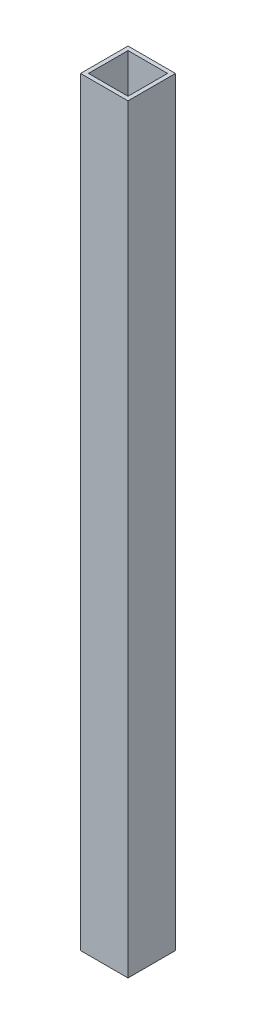
ISO-10303-21;
HEADER;
FILE_DESCRIPTION(('STEP AP214'),'2;1');
FILE_NAME('part.step','',(''),(''),'','','');
FILE_SCHEMA(('AUTOMOTIVE_DESIGN { 1 0 10303 214 1 1 1 1 }'));
ENDSEC;
DATA;
#1=APPLICATION_CONTEXT('core data for automotive mechanical design processes');
#2=APPLICATION_PROTOCOL_DEFINITION('international standard','automotive_design',2000,#1);
#3=PRODUCT_CONTEXT('',#1,'mechanical');
#4=PRODUCT('Part','Part','',(#3));
#5=PRODUCT_RELATED_PRODUCT_CATEGORY('part','',(#4));
#6=PRODUCT_DEFINITION_FORMATION('','',#4);
#7=PRODUCT_DEFINITION_CONTEXT('part definition',#1,'design');
#8=PRODUCT_DEFINITION('design','',#6,#7);
#9=PRODUCT_DEFINITION_SHAPE('','',#8);
#10=(LENGTH_UNIT() NAMED_UNIT(*) SI_UNIT(.MILLI.,.METRE.));
#11=(NAMED_UNIT(*) PLANE_ANGLE_UNIT() SI_UNIT($,.RADIAN.));
#12=(NAMED_UNIT(*) SI_UNIT($,.STERADIAN.) SOLID_ANGLE_UNIT());
#13=UNCERTAINTY_MEASURE_WITH_UNIT(LENGTH_MEASURE(1.E-05),#10,'distance_accuracy_value','');
#14=(GEOMETRIC_REPRESENTATION_CONTEXT(3) GLOBAL_UNCERTAINTY_ASSIGNED_CONTEXT((#13)) GLOBAL_UNIT_ASSIGNED_CONTEXT((#10,
#11,#12)) REPRESENTATION_CONTEXT('',''));
#15=CARTESIAN_POINT('',(0.,0.,0.));
#16=DIRECTION('',(0.,0.,1.));
#17=DIRECTION('',(1.,0.,0.));
#18=AXIS2_PLACEMENT_3D('',#15,#16,#17);
#19=CARTESIAN_POINT('',(0.,304.8,0.));
#20=DIRECTION('',(0.,-1.,0.));
#21=DIRECTION('',(0.,0.,-1.));
#22=AXIS2_PLACEMENT_3D('',#19,#20,#21);
#23=PLANE('',#22);
#24=DIRECTION('',(0.,0.,1.));
#25=VECTOR('',#24,1.);
#26=CARTESIAN_POINT('',(-9.525,304.8,-9.525));
#27=LINE('',#26,#25);
#28=CARTESIAN_POINT('',(-9.525,304.8,-9.525));
#29=VERTEX_POINT('',#28);
#30=CARTESIAN_POINT('',(-9.525,304.8,9.525));
#31=VERTEX_POINT('',#30);
#32=EDGE_CURVE('E159',#29,#31,#27,.T.);
#33=ORIENTED_EDGE('',*,*,#32,.T.);
#34=DIRECTION('',(1.,0.,0.));
#35=VECTOR('',#34,1.);
#36=CARTESIAN_POINT('',(9.525,304.8,9.525));
#37=LINE('',#36,#35);
#38=CARTESIAN_POINT('',(9.525,304.8,9.525));
#39=VERTEX_POINT('',#38);
#40=EDGE_CURVE('E163',#31,#39,#37,.T.);
#41=ORIENTED_EDGE('',*,*,#40,.T.);
#42=DIRECTION('',(0.,0.,-1.));
#43=VECTOR('',#42,1.);
#44=CARTESIAN_POINT('',(9.525,304.8,-9.52500000000001));
#45=LINE('',#44,#43);
#46=CARTESIAN_POINT('',(9.525,304.8,-9.52500000000001));
#47=VERTEX_POINT('',#46);
#48=EDGE_CURVE('E167',#39,#47,#45,.T.);
#49=ORIENTED_EDGE('',*,*,#48,.T.);
#50=DIRECTION('',(-1.,0.,0.));
#51=VECTOR('',#50,1.);
#52=CARTESIAN_POINT('',(9.525,304.8,-9.52500000000001));
#53=LINE('',#52,#51);
#54=EDGE_CURVE('E170',#47,#29,#53,.T.);
#55=ORIENTED_EDGE('',*,*,#54,.T.);
#56=EDGE_LOOP('',(#33,#41,#49,#55));
#57=FACE_BOUND('',#56,.T.);
#58=DIRECTION('',(0.,0.,1.));
#59=VECTOR('',#58,1.);
#60=CARTESIAN_POINT('',(-7.93750000000003,304.8,7.93750000000004));
#61=LINE('',#60,#59);
#62=CARTESIAN_POINT('',(-7.93750000000003,304.8,-7.93750000000001));
#63=VERTEX_POINT('',#62);
#64=CARTESIAN_POINT('',(-7.93750000000003,304.8,7.93750000000004));
#65=VERTEX_POINT('',#64);
#66=EDGE_CURVE('E111',#63,#65,#61,.T.);
#67=ORIENTED_EDGE('',*,*,#66,.F.);
#68=DIRECTION('',(-1.,0.,0.));
#69=VECTOR('',#68,1.);
#70=CARTESIAN_POINT('',(7.93750000000002,304.8,-7.93750000000001));
#71=LINE('',#70,#69);
#72=CARTESIAN_POINT('',(7.93750000000002,304.8,-7.93750000000001));
#73=VERTEX_POINT('',#72);
#74=EDGE_CURVE('E137',#73,#63,#71,.T.);
#75=ORIENTED_EDGE('',*,*,#74,.F.);
#76=DIRECTION('',(0.,0.,-1.));
#77=VECTOR('',#76,1.);
#78=CARTESIAN_POINT('',(7.93750000000002,304.8,7.93750000000004));
#79=LINE('',#78,#77);
#80=CARTESIAN_POINT('',(7.93750000000002,304.8,7.93750000000004));
#81=VERTEX_POINT('',#80);
#82=EDGE_CURVE('E133',#81,#73,#79,.T.);
#83=ORIENTED_EDGE('',*,*,#82,.F.);
#84=DIRECTION('',(1.,0.,0.));
#85=VECTOR('',#84,1.);
#86=CARTESIAN_POINT('',(7.93750000000002,304.8,7.93750000000004));
#87=LINE('',#86,#85);
#88=EDGE_CURVE('E120',#65,#81,#87,.T.);
#89=ORIENTED_EDGE('',*,*,#88,.F.);
#90=EDGE_LOOP('',(#67,#75,#83,#89));
#91=FACE_BOUND('',#90,.T.);
#92=ADVANCED_FACE('F45',(#57,#91),#23,.F.);
#93=CARTESIAN_POINT('',(0.,0.,0.));
#94=DIRECTION('',(0.,-1.,0.));
#95=DIRECTION('',(0.,0.,-1.));
#96=AXIS2_PLACEMENT_3D('',#93,#94,#95);
#97=PLANE('',#96);
#98=DIRECTION('',(0.,0.,1.));
#99=VECTOR('',#98,1.);
#100=CARTESIAN_POINT('',(-9.525,0.,-9.525));
#101=LINE('',#100,#99);
#102=CARTESIAN_POINT('',(-9.525,0.,-9.525));
#103=VERTEX_POINT('',#102);
#104=CARTESIAN_POINT('',(-9.525,0.,9.525));
#105=VERTEX_POINT('',#104);
#106=EDGE_CURVE('E129',#103,#105,#101,.T.);
#107=ORIENTED_EDGE('',*,*,#106,.F.);
#108=DIRECTION('',(-1.,0.,0.));
#109=VECTOR('',#108,1.);
#110=CARTESIAN_POINT('',(9.525,0.,-9.52500000000001));
#111=LINE('',#110,#109);
#112=CARTESIAN_POINT('',(9.525,0.,-9.52500000000001));
#113=VERTEX_POINT('',#112);
#114=EDGE_CURVE('E164',#113,#103,#111,.T.);
#115=ORIENTED_EDGE('',*,*,#114,.F.);
#116=DIRECTION('',(0.,0.,-1.));
#117=VECTOR('',#116,1.);
#118=CARTESIAN_POINT('',(9.525,0.,-9.52500000000001));
#119=LINE('',#118,#117);
#120=CARTESIAN_POINT('',(9.525,0.,9.525));
#121=VERTEX_POINT('',#120);
#122=EDGE_CURVE('E180',#121,#113,#119,.T.);
#123=ORIENTED_EDGE('',*,*,#122,.F.);
#124=DIRECTION('',(1.,0.,0.));
#125=VECTOR('',#124,1.);
#126=CARTESIAN_POINT('',(9.525,0.,9.525));
#127=LINE('',#126,#125);
#128=EDGE_CURVE('E177',#105,#121,#127,.T.);
#129=ORIENTED_EDGE('',*,*,#128,.F.);
#130=EDGE_LOOP('',(#107,#115,#123,#129));
#131=FACE_BOUND('',#130,.T.);
#132=DIRECTION('',(-1.,0.,0.));
#133=VECTOR('',#132,1.);
#134=CARTESIAN_POINT('',(7.93750000000002,0.,-7.93750000000001));
#135=LINE('',#134,#133);
#136=CARTESIAN_POINT('',(7.93750000000002,0.,-7.93750000000001));
#137=VERTEX_POINT('',#136);
#138=CARTESIAN_POINT('',(-7.93750000000003,0.,-7.93750000000001));
#139=VERTEX_POINT('',#138);
#140=EDGE_CURVE('E121',#137,#139,#135,.T.);
#141=ORIENTED_EDGE('',*,*,#140,.T.);
#142=DIRECTION('',(0.,0.,1.));
#143=VECTOR('',#142,1.);
#144=CARTESIAN_POINT('',(-7.93750000000003,0.,7.93750000000004));
#145=LINE('',#144,#143);
#146=CARTESIAN_POINT('',(-7.93750000000003,0.,7.93750000000004));
#147=VERTEX_POINT('',#146);
#148=EDGE_CURVE('E69',#139,#147,#145,.T.);
#149=ORIENTED_EDGE('',*,*,#148,.T.);
#150=DIRECTION('',(1.,0.,0.));
#151=VECTOR('',#150,1.);
#152=CARTESIAN_POINT('',(7.93750000000002,0.,7.93750000000004));
#153=LINE('',#152,#151);
#154=CARTESIAN_POINT('',(7.93750000000002,0.,7.93750000000004));
#155=VERTEX_POINT('',#154);
#156=EDGE_CURVE('E127',#147,#155,#153,.T.);
#157=ORIENTED_EDGE('',*,*,#156,.T.);
#158=DIRECTION('',(0.,0.,-1.));
#159=VECTOR('',#158,1.);
#160=CARTESIAN_POINT('',(7.93750000000002,0.,7.93750000000004));
#161=LINE('',#160,#159);
#162=EDGE_CURVE('E146',#155,#137,#161,.T.);
#163=ORIENTED_EDGE('',*,*,#162,.T.);
#164=EDGE_LOOP('',(#141,#149,#157,#163));
#165=FACE_BOUND('',#164,.T.);
#166=ADVANCED_FACE('F203',(#131,#165),#97,.T.);
#167=CARTESIAN_POINT('',(-9.525,304.8,-9.525));
#168=DIRECTION('',(1.,0.,0.));
#169=DIRECTION('',(0.,0.,-1.));
#170=AXIS2_PLACEMENT_3D('',#167,#168,#169);
#171=PLANE('',#170);
#172=ORIENTED_EDGE('',*,*,#106,.T.);
#173=DIRECTION('',(0.,-1.,0.));
#174=VECTOR('',#173,1.);
#175=CARTESIAN_POINT('',(-9.525,304.8,9.525));
#176=LINE('',#175,#174);
#177=EDGE_CURVE('E11',#31,#105,#176,.T.);
#178=ORIENTED_EDGE('',*,*,#177,.F.);
#179=ORIENTED_EDGE('',*,*,#32,.F.);
#180=DIRECTION('',(0.,-1.,0.));
#181=VECTOR('',#180,1.);
#182=CARTESIAN_POINT('',(-9.525,304.8,-9.525));
#183=LINE('',#182,#181);
#184=EDGE_CURVE('E173',#29,#103,#183,.T.);
#185=ORIENTED_EDGE('',*,*,#184,.T.);
#186=EDGE_LOOP('',(#172,#178,#179,#185));
#187=FACE_BOUND('',#186,.T.);
#188=ADVANCED_FACE('F47',(#187),#171,.F.);
#189=CARTESIAN_POINT('',(9.525,304.8,9.525));
#190=DIRECTION('',(0.,0.,-1.));
#191=DIRECTION('',(-1.,0.,0.));
#192=AXIS2_PLACEMENT_3D('',#189,#190,#191);
#193=PLANE('',#192);
#194=ORIENTED_EDGE('',*,*,#128,.T.);
#195=DIRECTION('',(0.,-1.,0.));
#196=VECTOR('',#195,1.);
#197=CARTESIAN_POINT('',(9.525,304.8,9.525));
#198=LINE('',#197,#196);
#199=EDGE_CURVE('E54',#39,#121,#198,.T.);
#200=ORIENTED_EDGE('',*,*,#199,.F.);
#201=ORIENTED_EDGE('',*,*,#40,.F.);
#202=ORIENTED_EDGE('',*,*,#177,.T.);
#203=EDGE_LOOP('',(#194,#200,#201,#202));
#204=FACE_BOUND('',#203,.T.);
#205=ADVANCED_FACE('F213',(#204),#193,.F.);
#206=CARTESIAN_POINT('',(9.525,304.8,-9.52500000000001));
#207=DIRECTION('',(-1.,0.,0.));
#208=DIRECTION('',(0.,0.,1.));
#209=AXIS2_PLACEMENT_3D('',#206,#207,#208);
#210=PLANE('',#209);
#211=ORIENTED_EDGE('',*,*,#122,.T.);
#212=DIRECTION('',(0.,-1.,0.));
#213=VECTOR('',#212,1.);
#214=CARTESIAN_POINT('',(9.525,304.8,-9.52500000000001));
#215=LINE('',#214,#213);
#216=EDGE_CURVE('E188',#47,#113,#215,.T.);
#217=ORIENTED_EDGE('',*,*,#216,.F.);
#218=ORIENTED_EDGE('',*,*,#48,.F.);
#219=ORIENTED_EDGE('',*,*,#199,.T.);
#220=EDGE_LOOP('',(#211,#217,#218,#219));
#221=FACE_BOUND('',#220,.T.);
#222=ADVANCED_FACE('F197',(#221),#210,.F.);
#223=CARTESIAN_POINT('',(9.525,304.8,-9.52500000000001));
#224=DIRECTION('',(0.,0.,1.));
#225=DIRECTION('',(1.,0.,0.));
#226=AXIS2_PLACEMENT_3D('',#223,#224,#225);
#227=PLANE('',#226);
#228=ORIENTED_EDGE('',*,*,#114,.T.);
#229=ORIENTED_EDGE('',*,*,#184,.F.);
#230=ORIENTED_EDGE('',*,*,#54,.F.);
#231=ORIENTED_EDGE('',*,*,#216,.T.);
#232=EDGE_LOOP('',(#228,#229,#230,#231));
#233=FACE_BOUND('',#232,.T.);
#234=ADVANCED_FACE('F207',(#233),#227,.F.);
#235=CARTESIAN_POINT('',(-7.93750000000003,304.8,7.93750000000004));
#236=DIRECTION('',(1.,0.,0.));
#237=DIRECTION('',(0.,0.,-1.));
#238=AXIS2_PLACEMENT_3D('',#235,#236,#237);
#239=PLANE('',#238);
#240=ORIENTED_EDGE('',*,*,#148,.F.);
#241=DIRECTION('',(0.,-1.,0.));
#242=VECTOR('',#241,1.);
#243=CARTESIAN_POINT('',(-7.93750000000003,304.8,-7.93750000000001));
#244=LINE('',#243,#242);
#245=EDGE_CURVE('E115',#63,#139,#244,.T.);
#246=ORIENTED_EDGE('',*,*,#245,.F.);
#247=ORIENTED_EDGE('',*,*,#66,.T.);
#248=DIRECTION('',(0.,-1.,0.));
#249=VECTOR('',#248,1.);
#250=CARTESIAN_POINT('',(-7.93750000000003,304.8,7.93750000000004));
#251=LINE('',#250,#249);
#252=EDGE_CURVE('E114',#65,#147,#251,.T.);
#253=ORIENTED_EDGE('',*,*,#252,.T.);
#254=EDGE_LOOP('',(#240,#246,#247,#253));
#255=FACE_BOUND('',#254,.T.);
#256=ADVANCED_FACE('F113',(#255),#239,.T.);
#257=CARTESIAN_POINT('',(7.93750000000002,304.8,7.93750000000004));
#258=DIRECTION('',(0.,0.,-1.));
#259=DIRECTION('',(-1.,0.,0.));
#260=AXIS2_PLACEMENT_3D('',#257,#258,#259);
#261=PLANE('',#260);
#262=ORIENTED_EDGE('',*,*,#156,.F.);
#263=ORIENTED_EDGE('',*,*,#252,.F.);
#264=ORIENTED_EDGE('',*,*,#88,.T.);
#265=DIRECTION('',(0.,-1.,0.));
#266=VECTOR('',#265,1.);
#267=CARTESIAN_POINT('',(7.93750000000002,304.8,7.93750000000004));
#268=LINE('',#267,#266);
#269=EDGE_CURVE('E130',#81,#155,#268,.T.);
#270=ORIENTED_EDGE('',*,*,#269,.T.);
#271=EDGE_LOOP('',(#262,#263,#264,#270));
#272=FACE_BOUND('',#271,.T.);
#273=ADVANCED_FACE('F124',(#272),#261,.T.);
#274=CARTESIAN_POINT('',(7.93750000000002,304.8,7.93750000000004));
#275=DIRECTION('',(-1.,0.,0.));
#276=DIRECTION('',(0.,0.,1.));
#277=AXIS2_PLACEMENT_3D('',#274,#275,#276);
#278=PLANE('',#277);
#279=ORIENTED_EDGE('',*,*,#162,.F.);
#280=ORIENTED_EDGE('',*,*,#269,.F.);
#281=ORIENTED_EDGE('',*,*,#82,.T.);
#282=DIRECTION('',(0.,-1.,0.));
#283=VECTOR('',#282,1.);
#284=CARTESIAN_POINT('',(7.93750000000002,304.8,-7.93750000000001));
#285=LINE('',#284,#283);
#286=EDGE_CURVE('E61',#73,#137,#285,.T.);
#287=ORIENTED_EDGE('',*,*,#286,.T.);
#288=EDGE_LOOP('',(#279,#280,#281,#287));
#289=FACE_BOUND('',#288,.T.);
#290=ADVANCED_FACE('F236',(#289),#278,.T.);
#291=CARTESIAN_POINT('',(7.93750000000002,304.8,-7.93750000000001));
#292=DIRECTION('',(0.,0.,1.));
#293=DIRECTION('',(1.,0.,0.));
#294=AXIS2_PLACEMENT_3D('',#291,#292,#293);
#295=PLANE('',#294);
#296=ORIENTED_EDGE('',*,*,#140,.F.);
#297=ORIENTED_EDGE('',*,*,#286,.F.);
#298=ORIENTED_EDGE('',*,*,#74,.T.);
#299=ORIENTED_EDGE('',*,*,#245,.T.);
#300=EDGE_LOOP('',(#296,#297,#298,#299));
#301=FACE_BOUND('',#300,.T.);
#302=ADVANCED_FACE('F240',(#301),#295,.T.);
#303=CLOSED_SHELL('',(#92,#166,#188,#205,#222,#234,#256,#273,#290,#302));
#304=MANIFOLD_SOLID_BREP('B2',#303);
#305=ADVANCED_BREP_SHAPE_REPRESENTATION('',(#18,#304),#14);
#306=SHAPE_DEFINITION_REPRESENTATION(#9,#305);
ENDSEC;
END-ISO-10303-21;
